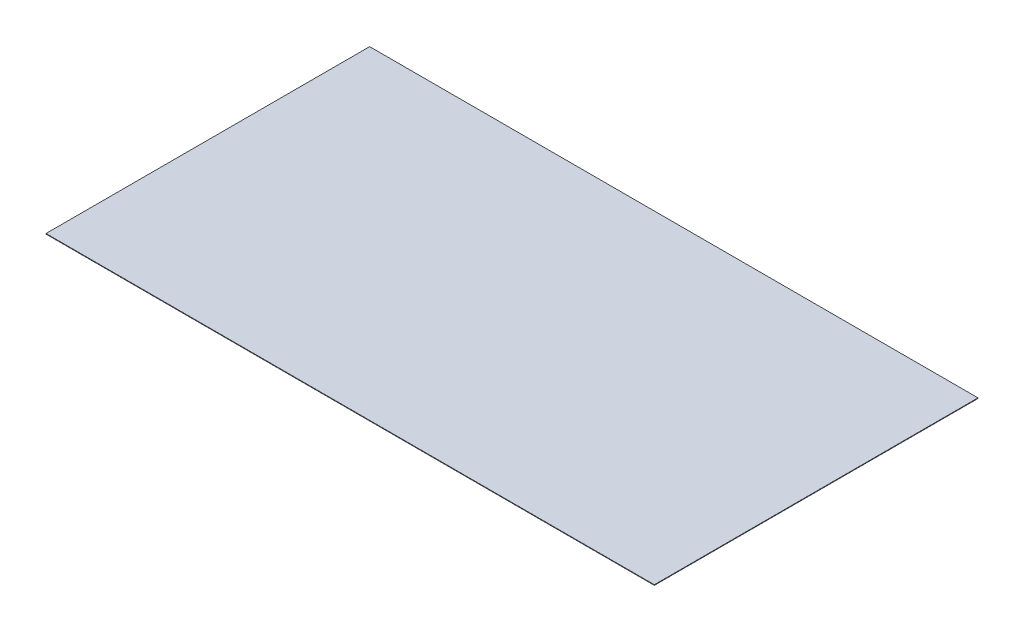
ISO-10303-21;
HEADER;
FILE_DESCRIPTION(('STEP AP214'),'2;1');
FILE_NAME('part.step','',(''),(''),'','','');
FILE_SCHEMA(('AUTOMOTIVE_DESIGN { 1 0 10303 214 1 1 1 1 }'));
ENDSEC;
DATA;
#1=APPLICATION_CONTEXT('core data for automotive mechanical design processes');
#2=APPLICATION_PROTOCOL_DEFINITION('international standard','automotive_design',2000,#1);
#3=PRODUCT_CONTEXT('',#1,'mechanical');
#4=PRODUCT('Part','Part','',(#3));
#5=PRODUCT_RELATED_PRODUCT_CATEGORY('part','',(#4));
#6=PRODUCT_DEFINITION_FORMATION('','',#4);
#7=PRODUCT_DEFINITION_CONTEXT('part definition',#1,'design');
#8=PRODUCT_DEFINITION('design','',#6,#7);
#9=PRODUCT_DEFINITION_SHAPE('','',#8);
#10=(LENGTH_UNIT() NAMED_UNIT(*) SI_UNIT(.MILLI.,.METRE.));
#11=(NAMED_UNIT(*) PLANE_ANGLE_UNIT() SI_UNIT($,.RADIAN.));
#12=(NAMED_UNIT(*) SI_UNIT($,.STERADIAN.) SOLID_ANGLE_UNIT());
#13=UNCERTAINTY_MEASURE_WITH_UNIT(LENGTH_MEASURE(1.E-05),#10,'distance_accuracy_value','');
#14=(GEOMETRIC_REPRESENTATION_CONTEXT(3) GLOBAL_UNCERTAINTY_ASSIGNED_CONTEXT((#13)) GLOBAL_UNIT_ASSIGNED_CONTEXT((#10,
#11,#12)) REPRESENTATION_CONTEXT('',''));
#15=CARTESIAN_POINT('',(0.,0.,0.));
#16=DIRECTION('',(0.,0.,1.));
#17=DIRECTION('',(1.,0.,0.));
#18=AXIS2_PLACEMENT_3D('',#15,#16,#17);
#19=CARTESIAN_POINT('',(-1094.,2.,582.));
#20=DIRECTION('',(1.,0.,0.));
#21=DIRECTION('',(0.,0.,-1.));
#22=AXIS2_PLACEMENT_3D('',#19,#20,#21);
#23=PLANE('',#22);
#24=DIRECTION('',(0.,0.,1.));
#25=VECTOR('',#24,1.);
#26=CARTESIAN_POINT('',(-1094.,0.,582.));
#27=LINE('',#26,#25);
#28=CARTESIAN_POINT('',(-1094.,0.,-582.));
#29=VERTEX_POINT('',#28);
#30=CARTESIAN_POINT('',(-1094.,0.,582.));
#31=VERTEX_POINT('',#30);
#32=EDGE_CURVE('E93',#29,#31,#27,.T.);
#33=ORIENTED_EDGE('',*,*,#32,.T.);
#34=DIRECTION('',(0.,-1.,0.));
#35=VECTOR('',#34,1.);
#36=CARTESIAN_POINT('',(-1094.,2.,582.));
#37=LINE('',#36,#35);
#38=CARTESIAN_POINT('',(-1094.,2.,582.));
#39=VERTEX_POINT('',#38);
#40=EDGE_CURVE('E11',#39,#31,#37,.T.);
#41=ORIENTED_EDGE('',*,*,#40,.F.);
#42=DIRECTION('',(0.,0.,1.));
#43=VECTOR('',#42,1.);
#44=CARTESIAN_POINT('',(-1094.,2.,582.));
#45=LINE('',#44,#43);
#46=CARTESIAN_POINT('',(-1094.,2.,-582.));
#47=VERTEX_POINT('',#46);
#48=EDGE_CURVE('E81',#47,#39,#45,.T.);
#49=ORIENTED_EDGE('',*,*,#48,.F.);
#50=DIRECTION('',(0.,-1.,0.));
#51=VECTOR('',#50,1.);
#52=CARTESIAN_POINT('',(-1094.,2.,-582.));
#53=LINE('',#52,#51);
#54=EDGE_CURVE('E89',#47,#29,#53,.T.);
#55=ORIENTED_EDGE('',*,*,#54,.T.);
#56=EDGE_LOOP('',(#33,#41,#49,#55));
#57=FACE_BOUND('',#56,.T.);
#58=ADVANCED_FACE('F30',(#57),#23,.F.);
#59=CARTESIAN_POINT('',(1094.,2.,582.));
#60=DIRECTION('',(0.,0.,-1.));
#61=DIRECTION('',(-1.,0.,0.));
#62=AXIS2_PLACEMENT_3D('',#59,#60,#61);
#63=PLANE('',#62);
#64=DIRECTION('',(1.,0.,0.));
#65=VECTOR('',#64,1.);
#66=CARTESIAN_POINT('',(1094.,0.,582.));
#67=LINE('',#66,#65);
#68=CARTESIAN_POINT('',(1094.,0.,582.));
#69=VERTEX_POINT('',#68);
#70=EDGE_CURVE('E85',#31,#69,#67,.T.);
#71=ORIENTED_EDGE('',*,*,#70,.T.);
#72=DIRECTION('',(0.,-1.,0.));
#73=VECTOR('',#72,1.);
#74=CARTESIAN_POINT('',(1094.,2.,582.));
#75=LINE('',#74,#73);
#76=CARTESIAN_POINT('',(1094.,2.,582.));
#77=VERTEX_POINT('',#76);
#78=EDGE_CURVE('E38',#77,#69,#75,.T.);
#79=ORIENTED_EDGE('',*,*,#78,.F.);
#80=DIRECTION('',(1.,0.,0.));
#81=VECTOR('',#80,1.);
#82=CARTESIAN_POINT('',(1094.,2.,582.));
#83=LINE('',#82,#81);
#84=EDGE_CURVE('E76',#39,#77,#83,.T.);
#85=ORIENTED_EDGE('',*,*,#84,.F.);
#86=ORIENTED_EDGE('',*,*,#40,.T.);
#87=EDGE_LOOP('',(#71,#79,#85,#86));
#88=FACE_BOUND('',#87,.T.);
#89=ADVANCED_FACE('F84',(#88),#63,.F.);
#90=CARTESIAN_POINT('',(1094.,2.,582.));
#91=DIRECTION('',(-1.,0.,0.));
#92=DIRECTION('',(0.,0.,1.));
#93=AXIS2_PLACEMENT_3D('',#90,#91,#92);
#94=PLANE('',#93);
#95=DIRECTION('',(0.,0.,-1.));
#96=VECTOR('',#95,1.);
#97=CARTESIAN_POINT('',(1094.,0.,582.));
#98=LINE('',#97,#96);
#99=CARTESIAN_POINT('',(1094.,0.,-582.));
#100=VERTEX_POINT('',#99);
#101=EDGE_CURVE('E63',#69,#100,#98,.T.);
#102=ORIENTED_EDGE('',*,*,#101,.T.);
#103=DIRECTION('',(0.,-1.,0.));
#104=VECTOR('',#103,1.);
#105=CARTESIAN_POINT('',(1094.,2.,-582.));
#106=LINE('',#105,#104);
#107=CARTESIAN_POINT('',(1094.,2.,-582.));
#108=VERTEX_POINT('',#107);
#109=EDGE_CURVE('E86',#108,#100,#106,.T.);
#110=ORIENTED_EDGE('',*,*,#109,.F.);
#111=DIRECTION('',(0.,0.,-1.));
#112=VECTOR('',#111,1.);
#113=CARTESIAN_POINT('',(1094.,2.,582.));
#114=LINE('',#113,#112);
#115=EDGE_CURVE('E79',#77,#108,#114,.T.);
#116=ORIENTED_EDGE('',*,*,#115,.F.);
#117=ORIENTED_EDGE('',*,*,#78,.T.);
#118=EDGE_LOOP('',(#102,#110,#116,#117));
#119=FACE_BOUND('',#118,.T.);
#120=ADVANCED_FACE('F87',(#119),#94,.F.);
#121=CARTESIAN_POINT('',(1094.,2.,-582.));
#122=DIRECTION('',(0.,0.,1.));
#123=DIRECTION('',(1.,0.,0.));
#124=AXIS2_PLACEMENT_3D('',#121,#122,#123);
#125=PLANE('',#124);
#126=DIRECTION('',(-1.,0.,0.));
#127=VECTOR('',#126,1.);
#128=CARTESIAN_POINT('',(1094.,0.,-582.));
#129=LINE('',#128,#127);
#130=EDGE_CURVE('E69',#100,#29,#129,.T.);
#131=ORIENTED_EDGE('',*,*,#130,.T.);
#132=ORIENTED_EDGE('',*,*,#54,.F.);
#133=DIRECTION('',(-1.,0.,0.));
#134=VECTOR('',#133,1.);
#135=CARTESIAN_POINT('',(1094.,2.,-582.));
#136=LINE('',#135,#134);
#137=EDGE_CURVE('E46',#108,#47,#136,.T.);
#138=ORIENTED_EDGE('',*,*,#137,.F.);
#139=ORIENTED_EDGE('',*,*,#109,.T.);
#140=EDGE_LOOP('',(#131,#132,#138,#139));
#141=FACE_BOUND('',#140,.T.);
#142=ADVANCED_FACE('F100',(#141),#125,.F.);
#143=CARTESIAN_POINT('',(-1094.,2.,-582.));
#144=DIRECTION('',(0.,1.,0.));
#145=DIRECTION('',(0.,0.,1.));
#146=AXIS2_PLACEMENT_3D('',#143,#144,#145);
#147=PLANE('',#146);
#148=ORIENTED_EDGE('',*,*,#48,.T.);
#149=ORIENTED_EDGE('',*,*,#84,.T.);
#150=ORIENTED_EDGE('',*,*,#115,.T.);
#151=ORIENTED_EDGE('',*,*,#137,.T.);
#152=EDGE_LOOP('',(#148,#149,#150,#151));
#153=FACE_BOUND('',#152,.T.);
#154=ADVANCED_FACE('F77',(#153),#147,.T.);
#155=CARTESIAN_POINT('',(-1094.,0.,-582.));
#156=DIRECTION('',(0.,1.,0.));
#157=DIRECTION('',(0.,0.,1.));
#158=AXIS2_PLACEMENT_3D('',#155,#156,#157);
#159=PLANE('',#158);
#160=ORIENTED_EDGE('',*,*,#32,.F.);
#161=ORIENTED_EDGE('',*,*,#130,.F.);
#162=ORIENTED_EDGE('',*,*,#101,.F.);
#163=ORIENTED_EDGE('',*,*,#70,.F.);
#164=EDGE_LOOP('',(#160,#161,#162,#163));
#165=FACE_BOUND('',#164,.T.);
#166=ADVANCED_FACE('F103',(#165),#159,.F.);
#167=CLOSED_SHELL('',(#58,#89,#120,#142,#154,#166));
#168=MANIFOLD_SOLID_BREP('B2',#167);
#169=ADVANCED_BREP_SHAPE_REPRESENTATION('',(#18,#168),#14);
#170=SHAPE_DEFINITION_REPRESENTATION(#9,#169);
ENDSEC;
END-ISO-10303-21;
